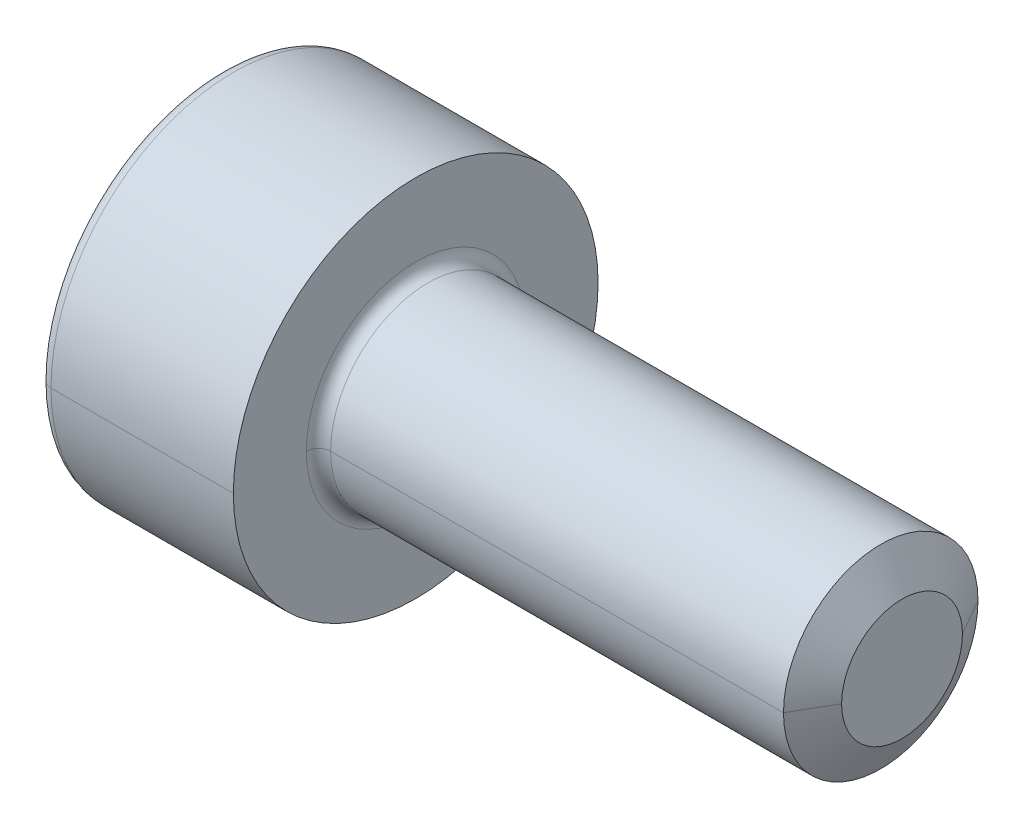
ISO-10303-21;
HEADER;
FILE_DESCRIPTION(('STEP AP214'),'2;1');
FILE_NAME('part.step','',(''),(''),'','','');
FILE_SCHEMA(('AUTOMOTIVE_DESIGN { 1 0 10303 214 1 1 1 1 }'));
ENDSEC;
DATA;
#1=APPLICATION_CONTEXT('core data for automotive mechanical design processes');
#2=APPLICATION_PROTOCOL_DEFINITION('international standard','automotive_design',2000,#1);
#3=PRODUCT_CONTEXT('',#1,'mechanical');
#4=PRODUCT('Part','Part','',(#3));
#5=PRODUCT_RELATED_PRODUCT_CATEGORY('part','',(#4));
#6=PRODUCT_DEFINITION_FORMATION('','',#4);
#7=PRODUCT_DEFINITION_CONTEXT('part definition',#1,'design');
#8=PRODUCT_DEFINITION('design','',#6,#7);
#9=PRODUCT_DEFINITION_SHAPE('','',#8);
#10=(LENGTH_UNIT() NAMED_UNIT(*) SI_UNIT(.MILLI.,.METRE.));
#11=(NAMED_UNIT(*) PLANE_ANGLE_UNIT() SI_UNIT($,.RADIAN.));
#12=(NAMED_UNIT(*) SI_UNIT($,.STERADIAN.) SOLID_ANGLE_UNIT());
#13=UNCERTAINTY_MEASURE_WITH_UNIT(LENGTH_MEASURE(1.E-05),#10,'distance_accuracy_value','');
#14=(GEOMETRIC_REPRESENTATION_CONTEXT(3) GLOBAL_UNCERTAINTY_ASSIGNED_CONTEXT((#13)) GLOBAL_UNIT_ASSIGNED_CONTEXT((#10,
#11,#12)) REPRESENTATION_CONTEXT('',''));
#15=CARTESIAN_POINT('',(0.,0.,0.));
#16=DIRECTION('',(0.,0.,1.));
#17=DIRECTION('',(1.,0.,0.));
#18=AXIS2_PLACEMENT_3D('',#15,#16,#17);
#19=CARTESIAN_POINT('',(5.6,0.8,0.));
#20=DIRECTION('',(1.,0.,0.));
#21=DIRECTION('',(0.,1.,0.));
#22=AXIS2_PLACEMENT_3D('',#19,#20,#21);
#23=PLANE('',#22);
#24=CARTESIAN_POINT('',(5.6,0.,0.));
#25=DIRECTION('',(-1.,0.,0.));
#26=DIRECTION('',(0.,0.,1.));
#27=AXIS2_PLACEMENT_3D('',#24,#25,#26);
#28=CIRCLE('',#27,0.4969);
#29=CARTESIAN_POINT('',(5.6,0.,0.4969));
#30=VERTEX_POINT('',#29);
#31=CARTESIAN_POINT('',(5.6,0.,-0.4969));
#32=VERTEX_POINT('',#31);
#33=EDGE_CURVE('E282',#30,#32,#28,.T.);
#34=ORIENTED_EDGE('',*,*,#33,.F.);
#35=CARTESIAN_POINT('',(5.6,0.,0.));
#36=DIRECTION('',(-1.,0.,0.));
#37=DIRECTION('',(0.,0.,1.));
#38=AXIS2_PLACEMENT_3D('',#35,#36,#37);
#39=CIRCLE('',#38,0.4969);
#40=EDGE_CURVE('E10',#32,#30,#39,.T.);
#41=ORIENTED_EDGE('',*,*,#40,.F.);
#42=EDGE_LOOP('',(#34,#41));
#43=FACE_BOUND('',#42,.T.);
#44=ADVANCED_FACE('F16',(#43),#23,.T.);
#45=CARTESIAN_POINT('',(5.425,0.,0.));
#46=DIRECTION('',(-1.,0.,0.));
#47=DIRECTION('',(0.,0.,1.));
#48=AXIS2_PLACEMENT_3D('',#45,#46,#47);
#49=CONICAL_SURFACE('',#48,0.8,1.04718484902492);
#50=DIRECTION('',(-0.500011000363017,0.,-0.866019052628737));
#51=VECTOR('',#50,1.);
#52=CARTESIAN_POINT('',(5.425,0.,-0.8));
#53=LINE('',#52,#51);
#54=CARTESIAN_POINT('',(5.425,0.,-0.8));
#55=VERTEX_POINT('',#54);
#56=EDGE_CURVE('E286',#32,#55,#53,.T.);
#57=ORIENTED_EDGE('',*,*,#56,.F.);
#58=ORIENTED_EDGE('',*,*,#40,.T.);
#59=DIRECTION('',(-0.500011000363017,0.,0.866019052628737));
#60=VECTOR('',#59,1.);
#61=CARTESIAN_POINT('',(5.425,0.,0.8));
#62=LINE('',#61,#60);
#63=CARTESIAN_POINT('',(5.425,0.,0.8));
#64=VERTEX_POINT('',#63);
#65=EDGE_CURVE('E300',#30,#64,#62,.T.);
#66=ORIENTED_EDGE('',*,*,#65,.T.);
#67=CARTESIAN_POINT('',(5.425,0.,0.));
#68=DIRECTION('',(-1.,0.,0.));
#69=DIRECTION('',(0.,0.,1.));
#70=AXIS2_PLACEMENT_3D('',#67,#68,#69);
#71=CIRCLE('',#70,0.8);
#72=EDGE_CURVE('E152',#55,#64,#71,.T.);
#73=ORIENTED_EDGE('',*,*,#72,.F.);
#74=EDGE_LOOP('',(#57,#58,#66,#73));
#75=FACE_BOUND('',#74,.T.);
#76=ADVANCED_FACE('F333',(#75),#49,.T.);
#77=CARTESIAN_POINT('',(0.1,0.,0.));
#78=DIRECTION('',(-1.,0.,0.));
#79=DIRECTION('',(0.,0.,1.));
#80=AXIS2_PLACEMENT_3D('',#77,#78,#79);
#81=TOROIDAL_SURFACE('',#80,1.4,0.1);
#82=CARTESIAN_POINT('',(0.1,0.,-1.4));
#83=DIRECTION('',(0.,1.,0.));
#84=DIRECTION('',(0.,0.,1.));
#85=AXIS2_PLACEMENT_3D('',#82,#83,#84);
#86=CIRCLE('',#85,0.1);
#87=CARTESIAN_POINT('',(0.1,0.,-1.5));
#88=VERTEX_POINT('',#87);
#89=CARTESIAN_POINT('',(0.,0.,-1.4));
#90=VERTEX_POINT('',#89);
#91=EDGE_CURVE('E169',#88,#90,#86,.T.);
#92=ORIENTED_EDGE('',*,*,#91,.F.);
#93=CARTESIAN_POINT('',(0.1,0.,0.));
#94=DIRECTION('',(1.,0.,0.));
#95=DIRECTION('',(0.,0.,1.));
#96=AXIS2_PLACEMENT_3D('',#93,#94,#95);
#97=CIRCLE('',#96,1.5);
#98=CARTESIAN_POINT('',(0.1,0.,1.5));
#99=VERTEX_POINT('',#98);
#100=EDGE_CURVE('E157',#99,#88,#97,.T.);
#101=ORIENTED_EDGE('',*,*,#100,.F.);
#102=CARTESIAN_POINT('',(0.1,0.,1.4));
#103=DIRECTION('',(0.,-1.,0.));
#104=DIRECTION('',(0.,0.,-1.));
#105=AXIS2_PLACEMENT_3D('',#102,#103,#104);
#106=CIRCLE('',#105,0.1);
#107=CARTESIAN_POINT('',(0.,0.,1.4));
#108=VERTEX_POINT('',#107);
#109=EDGE_CURVE('E160',#99,#108,#106,.T.);
#110=ORIENTED_EDGE('',*,*,#109,.T.);
#111=CARTESIAN_POINT('',(0.,0.,0.));
#112=DIRECTION('',(-1.,0.,0.));
#113=DIRECTION('',(0.,0.,1.));
#114=AXIS2_PLACEMENT_3D('',#111,#112,#113);
#115=CIRCLE('',#114,1.4);
#116=EDGE_CURVE('E145',#90,#108,#115,.T.);
#117=ORIENTED_EDGE('',*,*,#116,.F.);
#118=EDGE_LOOP('',(#92,#101,#110,#117));
#119=FACE_BOUND('',#118,.T.);
#120=ADVANCED_FACE('F158',(#119),#81,.T.);
#121=CARTESIAN_POINT('',(0.7,-0.4325,0.749111974273539));
#122=DIRECTION('',(-1.,0.,0.));
#123=DIRECTION('',(0.,0.,1.));
#124=AXIS2_PLACEMENT_3D('',#121,#122,#123);
#125=PLANE('',#124);
#126=DIRECTION('',(0.,0.5,0.866025403784439));
#127=VECTOR('',#126,1.);
#128=CARTESIAN_POINT('',(0.7,-0.865,0.));
#129=LINE('',#128,#127);
#130=CARTESIAN_POINT('',(0.7,-0.865,0.));
#131=VERTEX_POINT('',#130);
#132=CARTESIAN_POINT('',(0.7,-0.4325,0.749111974273539));
#133=VERTEX_POINT('',#132);
#134=EDGE_CURVE('E247',#131,#133,#129,.T.);
#135=ORIENTED_EDGE('',*,*,#134,.T.);
#136=DIRECTION('',(0.,1.,0.));
#137=VECTOR('',#136,1.);
#138=CARTESIAN_POINT('',(0.7,-0.4325,0.749111974273539));
#139=LINE('',#138,#137);
#140=CARTESIAN_POINT('',(0.7,0.4325,0.749111974273539));
#141=VERTEX_POINT('',#140);
#142=EDGE_CURVE('E25',#133,#141,#139,.T.);
#143=ORIENTED_EDGE('',*,*,#142,.T.);
#144=DIRECTION('',(0.,0.5,-0.866025403784439));
#145=VECTOR('',#144,1.);
#146=CARTESIAN_POINT('',(0.7,0.4325,0.749111974273539));
#147=LINE('',#146,#145);
#148=CARTESIAN_POINT('',(0.7,0.865,0.));
#149=VERTEX_POINT('',#148);
#150=EDGE_CURVE('E46',#141,#149,#147,.T.);
#151=ORIENTED_EDGE('',*,*,#150,.T.);
#152=DIRECTION('',(0.,-0.5,-0.866025403784439));
#153=VECTOR('',#152,1.);
#154=CARTESIAN_POINT('',(0.7,0.865,0.));
#155=LINE('',#154,#153);
#156=CARTESIAN_POINT('',(0.7,0.4325,-0.74911197427354));
#157=VERTEX_POINT('',#156);
#158=EDGE_CURVE('E265',#149,#157,#155,.T.);
#159=ORIENTED_EDGE('',*,*,#158,.T.);
#160=DIRECTION('',(0.,-1.,0.));
#161=VECTOR('',#160,1.);
#162=CARTESIAN_POINT('',(0.7,0.4325,-0.74911197427354));
#163=LINE('',#162,#161);
#164=CARTESIAN_POINT('',(0.7,-0.4325,-0.74911197427354));
#165=VERTEX_POINT('',#164);
#166=EDGE_CURVE('E219',#157,#165,#163,.T.);
#167=ORIENTED_EDGE('',*,*,#166,.T.);
#168=DIRECTION('',(0.,-0.5,0.866025403784439));
#169=VECTOR('',#168,1.);
#170=CARTESIAN_POINT('',(0.7,-0.4325,-0.74911197427354));
#171=LINE('',#170,#169);
#172=EDGE_CURVE('E254',#165,#131,#171,.T.);
#173=ORIENTED_EDGE('',*,*,#172,.T.);
#174=EDGE_LOOP('',(#135,#143,#151,#159,#167,#173));
#175=FACE_BOUND('',#174,.T.);
#176=ADVANCED_FACE('F369',(#175),#125,.T.);
#177=CARTESIAN_POINT('',(0.7,-0.4325,0.749111974273539));
#178=DIRECTION('',(0.,0.,1.));
#179=DIRECTION('',(1.,0.,0.));
#180=AXIS2_PLACEMENT_3D('',#177,#178,#179);
#181=PLANE('',#180);
#182=DIRECTION('',(0.,1.,0.));
#183=VECTOR('',#182,1.);
#184=CARTESIAN_POINT('',(0.,-0.4325,0.749111974273539));
#185=LINE('',#184,#183);
#186=CARTESIAN_POINT('',(0.,-0.4325,0.749111974273539));
#187=VERTEX_POINT('',#186);
#188=CARTESIAN_POINT('',(0.,0.4325,0.749111974273539));
#189=VERTEX_POINT('',#188);
#190=EDGE_CURVE('E240',#187,#189,#185,.T.);
#191=ORIENTED_EDGE('',*,*,#190,.T.);
#192=DIRECTION('',(-1.,0.,0.));
#193=VECTOR('',#192,1.);
#194=CARTESIAN_POINT('',(0.7,0.4325,0.749111974273539));
#195=LINE('',#194,#193);
#196=EDGE_CURVE('E19',#141,#189,#195,.T.);
#197=ORIENTED_EDGE('',*,*,#196,.F.);
#198=ORIENTED_EDGE('',*,*,#142,.F.);
#199=DIRECTION('',(-1.,0.,0.));
#200=VECTOR('',#199,1.);
#201=CARTESIAN_POINT('',(0.7,-0.4325,0.749111974273539));
#202=LINE('',#201,#200);
#203=EDGE_CURVE('E239',#133,#187,#202,.T.);
#204=ORIENTED_EDGE('',*,*,#203,.T.);
#205=EDGE_LOOP('',(#191,#197,#198,#204));
#206=FACE_BOUND('',#205,.T.);
#207=ADVANCED_FACE('F368',(#206),#181,.F.);
#208=CARTESIAN_POINT('',(0.7,0.4325,0.749111974273539));
#209=DIRECTION('',(0.,0.866025403784439,0.5));
#210=DIRECTION('',(1.,0.,0.));
#211=AXIS2_PLACEMENT_3D('',#208,#209,#210);
#212=PLANE('',#211);
#213=DIRECTION('',(0.,0.5,-0.866025403784439));
#214=VECTOR('',#213,1.);
#215=CARTESIAN_POINT('',(0.,0.4325,0.749111974273539));
#216=LINE('',#215,#214);
#217=CARTESIAN_POINT('',(0.,0.865,0.));
#218=VERTEX_POINT('',#217);
#219=EDGE_CURVE('E235',#189,#218,#216,.T.);
#220=ORIENTED_EDGE('',*,*,#219,.T.);
#221=DIRECTION('',(-1.,0.,0.));
#222=VECTOR('',#221,1.);
#223=CARTESIAN_POINT('',(0.7,0.865,0.));
#224=LINE('',#223,#222);
#225=EDGE_CURVE('E264',#149,#218,#224,.T.);
#226=ORIENTED_EDGE('',*,*,#225,.F.);
#227=ORIENTED_EDGE('',*,*,#150,.F.);
#228=ORIENTED_EDGE('',*,*,#196,.T.);
#229=EDGE_LOOP('',(#220,#226,#227,#228));
#230=FACE_BOUND('',#229,.T.);
#231=ADVANCED_FACE('F366',(#230),#212,.F.);
#232=CARTESIAN_POINT('',(0.7,0.865,0.));
#233=DIRECTION('',(0.,0.866025403784439,-0.5));
#234=DIRECTION('',(-1.,0.,0.));
#235=AXIS2_PLACEMENT_3D('',#232,#233,#234);
#236=PLANE('',#235);
#237=DIRECTION('',(0.,-0.5,-0.866025403784439));
#238=VECTOR('',#237,1.);
#239=CARTESIAN_POINT('',(0.,0.865,0.));
#240=LINE('',#239,#238);
#241=CARTESIAN_POINT('',(0.,0.4325,-0.74911197427354));
#242=VERTEX_POINT('',#241);
#243=EDGE_CURVE('E229',#218,#242,#240,.T.);
#244=ORIENTED_EDGE('',*,*,#243,.T.);
#245=DIRECTION('',(-1.,0.,0.));
#246=VECTOR('',#245,1.);
#247=CARTESIAN_POINT('',(0.7,0.4325,-0.74911197427354));
#248=LINE('',#247,#246);
#249=EDGE_CURVE('E224',#157,#242,#248,.T.);
#250=ORIENTED_EDGE('',*,*,#249,.F.);
#251=ORIENTED_EDGE('',*,*,#158,.F.);
#252=ORIENTED_EDGE('',*,*,#225,.T.);
#253=EDGE_LOOP('',(#244,#250,#251,#252));
#254=FACE_BOUND('',#253,.T.);
#255=ADVANCED_FACE('F379',(#254),#236,.F.);
#256=CARTESIAN_POINT('',(0.7,0.4325,-0.74911197427354));
#257=DIRECTION('',(0.,0.,-1.));
#258=DIRECTION('',(0.,-1.,0.));
#259=AXIS2_PLACEMENT_3D('',#256,#257,#258);
#260=PLANE('',#259);
#261=DIRECTION('',(0.,-1.,0.));
#262=VECTOR('',#261,1.);
#263=CARTESIAN_POINT('',(0.,0.4325,-0.74911197427354));
#264=LINE('',#263,#262);
#265=CARTESIAN_POINT('',(0.,-0.4325,-0.74911197427354));
#266=VERTEX_POINT('',#265);
#267=EDGE_CURVE('E218',#242,#266,#264,.T.);
#268=ORIENTED_EDGE('',*,*,#267,.T.);
#269=DIRECTION('',(-1.,0.,0.));
#270=VECTOR('',#269,1.);
#271=CARTESIAN_POINT('',(0.7,-0.4325,-0.74911197427354));
#272=LINE('',#271,#270);
#273=EDGE_CURVE('E221',#165,#266,#272,.T.);
#274=ORIENTED_EDGE('',*,*,#273,.F.);
#275=ORIENTED_EDGE('',*,*,#166,.F.);
#276=ORIENTED_EDGE('',*,*,#249,.T.);
#277=EDGE_LOOP('',(#268,#274,#275,#276));
#278=FACE_BOUND('',#277,.T.);
#279=ADVANCED_FACE('F383',(#278),#260,.F.);
#280=CARTESIAN_POINT('',(0.7,-0.4325,-0.74911197427354));
#281=DIRECTION('',(0.,-0.866025403784439,-0.5));
#282=DIRECTION('',(0.,0.5,-0.866025403784439));
#283=AXIS2_PLACEMENT_3D('',#280,#281,#282);
#284=PLANE('',#283);
#285=DIRECTION('',(0.,-0.5,0.866025403784439));
#286=VECTOR('',#285,1.);
#287=CARTESIAN_POINT('',(0.,-0.4325,-0.74911197427354));
#288=LINE('',#287,#286);
#289=CARTESIAN_POINT('',(0.,-0.865,0.));
#290=VERTEX_POINT('',#289);
#291=EDGE_CURVE('E214',#266,#290,#288,.T.);
#292=ORIENTED_EDGE('',*,*,#291,.T.);
#293=DIRECTION('',(-1.,0.,0.));
#294=VECTOR('',#293,1.);
#295=CARTESIAN_POINT('',(0.7,-0.865,0.));
#296=LINE('',#295,#294);
#297=EDGE_CURVE('E252',#131,#290,#296,.T.);
#298=ORIENTED_EDGE('',*,*,#297,.F.);
#299=ORIENTED_EDGE('',*,*,#172,.F.);
#300=ORIENTED_EDGE('',*,*,#273,.T.);
#301=EDGE_LOOP('',(#292,#298,#299,#300));
#302=FACE_BOUND('',#301,.T.);
#303=ADVANCED_FACE('F405',(#302),#284,.F.);
#304=CARTESIAN_POINT('',(0.7,-0.865,0.));
#305=DIRECTION('',(0.,-0.866025403784439,0.5));
#306=DIRECTION('',(-1.,0.,0.));
#307=AXIS2_PLACEMENT_3D('',#304,#305,#306);
#308=PLANE('',#307);
#309=DIRECTION('',(0.,0.5,0.866025403784439));
#310=VECTOR('',#309,1.);
#311=CARTESIAN_POINT('',(0.,-0.865,0.));
#312=LINE('',#311,#310);
#313=EDGE_CURVE('E153',#290,#187,#312,.T.);
#314=ORIENTED_EDGE('',*,*,#313,.T.);
#315=ORIENTED_EDGE('',*,*,#203,.F.);
#316=ORIENTED_EDGE('',*,*,#134,.F.);
#317=ORIENTED_EDGE('',*,*,#297,.T.);
#318=EDGE_LOOP('',(#314,#315,#316,#317));
#319=FACE_BOUND('',#318,.T.);
#320=ADVANCED_FACE('F329',(#319),#308,.F.);
#321=CARTESIAN_POINT('',(1.7,0.,0.));
#322=DIRECTION('',(1.,0.,0.));
#323=DIRECTION('',(0.,0.,-1.));
#324=AXIS2_PLACEMENT_3D('',#321,#322,#323);
#325=TOROIDAL_SURFACE('',#324,0.9,0.1);
#326=CARTESIAN_POINT('',(1.7,0.,0.9));
#327=DIRECTION('',(0.,1.,0.));
#328=DIRECTION('',(0.,0.,1.));
#329=AXIS2_PLACEMENT_3D('',#326,#327,#328);
#330=CIRCLE('',#329,0.1);
#331=CARTESIAN_POINT('',(1.7,0.,0.8));
#332=VERTEX_POINT('',#331);
#333=CARTESIAN_POINT('',(1.6,0.,0.9));
#334=VERTEX_POINT('',#333);
#335=EDGE_CURVE('E179',#332,#334,#330,.T.);
#336=ORIENTED_EDGE('',*,*,#335,.F.);
#337=CARTESIAN_POINT('',(1.7,0.,0.));
#338=DIRECTION('',(1.,0.,0.));
#339=DIRECTION('',(0.,0.,-1.));
#340=AXIS2_PLACEMENT_3D('',#337,#338,#339);
#341=CIRCLE('',#340,0.8);
#342=CARTESIAN_POINT('',(1.7,0.,-0.8));
#343=VERTEX_POINT('',#342);
#344=EDGE_CURVE('E196',#343,#332,#341,.T.);
#345=ORIENTED_EDGE('',*,*,#344,.F.);
#346=CARTESIAN_POINT('',(1.7,0.,-0.9));
#347=DIRECTION('',(0.,-1.,0.));
#348=DIRECTION('',(0.,0.,-1.));
#349=AXIS2_PLACEMENT_3D('',#346,#347,#348);
#350=CIRCLE('',#349,0.1);
#351=CARTESIAN_POINT('',(1.6,0.,-0.9));
#352=VERTEX_POINT('',#351);
#353=EDGE_CURVE('E192',#343,#352,#350,.T.);
#354=ORIENTED_EDGE('',*,*,#353,.T.);
#355=CARTESIAN_POINT('',(1.6,0.,0.));
#356=DIRECTION('',(1.,0.,0.));
#357=DIRECTION('',(0.,0.,-1.));
#358=AXIS2_PLACEMENT_3D('',#355,#356,#357);
#359=CIRCLE('',#358,0.9);
#360=EDGE_CURVE('E236',#352,#334,#359,.T.);
#361=ORIENTED_EDGE('',*,*,#360,.T.);
#362=EDGE_LOOP('',(#336,#345,#354,#361));
#363=FACE_BOUND('',#362,.T.);
#364=ADVANCED_FACE('F321',(#363),#325,.F.);
#365=CARTESIAN_POINT('',(1.6,1.5,0.));
#366=DIRECTION('',(1.,0.,0.));
#367=DIRECTION('',(0.,1.,0.));
#368=AXIS2_PLACEMENT_3D('',#365,#366,#367);
#369=PLANE('',#368);
#370=ORIENTED_EDGE('',*,*,#360,.F.);
#371=CARTESIAN_POINT('',(1.6,0.,0.));
#372=DIRECTION('',(1.,0.,0.));
#373=DIRECTION('',(0.,0.,-1.));
#374=AXIS2_PLACEMENT_3D('',#371,#372,#373);
#375=CIRCLE('',#374,0.9);
#376=EDGE_CURVE('E183',#334,#352,#375,.T.);
#377=ORIENTED_EDGE('',*,*,#376,.F.);
#378=EDGE_LOOP('',(#370,#377));
#379=FACE_BOUND('',#378,.T.);
#380=CARTESIAN_POINT('',(1.6,0.,0.));
#381=DIRECTION('',(1.,0.,0.));
#382=DIRECTION('',(0.,0.,-1.));
#383=AXIS2_PLACEMENT_3D('',#380,#381,#382);
#384=CIRCLE('',#383,1.5);
#385=CARTESIAN_POINT('',(1.6,0.,-1.5));
#386=VERTEX_POINT('',#385);
#387=CARTESIAN_POINT('',(1.6,0.,1.5));
#388=VERTEX_POINT('',#387);
#389=EDGE_CURVE('E184',#386,#388,#384,.T.);
#390=ORIENTED_EDGE('',*,*,#389,.T.);
#391=CARTESIAN_POINT('',(1.6,0.,0.));
#392=DIRECTION('',(1.,0.,0.));
#393=DIRECTION('',(0.,0.,-1.));
#394=AXIS2_PLACEMENT_3D('',#391,#392,#393);
#395=CIRCLE('',#394,1.5);
#396=EDGE_CURVE('E241',#388,#386,#395,.T.);
#397=ORIENTED_EDGE('',*,*,#396,.T.);
#398=EDGE_LOOP('',(#390,#397));
#399=FACE_BOUND('',#398,.T.);
#400=ADVANCED_FACE('F317',(#379,#399),#369,.T.);
#401=CARTESIAN_POINT('',(0.,0.,0.));
#402=DIRECTION('',(1.,0.,0.));
#403=DIRECTION('',(0.,0.,-1.));
#404=AXIS2_PLACEMENT_3D('',#401,#402,#403);
#405=CYLINDRICAL_SURFACE('',#404,1.5);
#406=DIRECTION('',(1.,0.,0.));
#407=VECTOR('',#406,1.);
#408=CARTESIAN_POINT('',(0.,0.,1.5));
#409=LINE('',#408,#407);
#410=EDGE_CURVE('E189',#99,#388,#409,.T.);
#411=ORIENTED_EDGE('',*,*,#410,.F.);
#412=ORIENTED_EDGE('',*,*,#100,.T.);
#413=DIRECTION('',(1.,0.,0.));
#414=VECTOR('',#413,1.);
#415=CARTESIAN_POINT('',(0.,0.,-1.5));
#416=LINE('',#415,#414);
#417=EDGE_CURVE('E188',#88,#386,#416,.T.);
#418=ORIENTED_EDGE('',*,*,#417,.T.);
#419=ORIENTED_EDGE('',*,*,#396,.F.);
#420=EDGE_LOOP('',(#411,#412,#418,#419));
#421=FACE_BOUND('',#420,.T.);
#422=ADVANCED_FACE('F320',(#421),#405,.T.);
#423=CARTESIAN_POINT('',(0.,0.,0.));
#424=DIRECTION('',(-1.,0.,0.));
#425=DIRECTION('',(0.,0.,1.));
#426=AXIS2_PLACEMENT_3D('',#423,#424,#425);
#427=PLANE('',#426);
#428=ORIENTED_EDGE('',*,*,#313,.F.);
#429=ORIENTED_EDGE('',*,*,#291,.F.);
#430=ORIENTED_EDGE('',*,*,#267,.F.);
#431=ORIENTED_EDGE('',*,*,#243,.F.);
#432=ORIENTED_EDGE('',*,*,#219,.F.);
#433=ORIENTED_EDGE('',*,*,#190,.F.);
#434=EDGE_LOOP('',(#428,#429,#430,#431,#432,#433));
#435=FACE_BOUND('',#434,.T.);
#436=CARTESIAN_POINT('',(0.,0.,0.));
#437=DIRECTION('',(-1.,0.,0.));
#438=DIRECTION('',(0.,0.,1.));
#439=AXIS2_PLACEMENT_3D('',#436,#437,#438);
#440=CIRCLE('',#439,1.4);
#441=EDGE_CURVE('E146',#108,#90,#440,.T.);
#442=ORIENTED_EDGE('',*,*,#441,.T.);
#443=ORIENTED_EDGE('',*,*,#116,.T.);
#444=EDGE_LOOP('',(#442,#443));
#445=FACE_BOUND('',#444,.T.);
#446=ADVANCED_FACE('F148',(#435,#445),#427,.T.);
#447=CARTESIAN_POINT('',(0.,0.,0.));
#448=DIRECTION('',(1.,0.,0.));
#449=DIRECTION('',(0.,0.,-1.));
#450=AXIS2_PLACEMENT_3D('',#447,#448,#449);
#451=CYLINDRICAL_SURFACE('',#450,0.8);
#452=DIRECTION('',(1.,0.,0.));
#453=VECTOR('',#452,1.);
#454=CARTESIAN_POINT('',(0.,0.,0.8));
#455=LINE('',#454,#453);
#456=EDGE_CURVE('E205',#332,#64,#455,.T.);
#457=ORIENTED_EDGE('',*,*,#456,.F.);
#458=CARTESIAN_POINT('',(1.7,0.,0.));
#459=DIRECTION('',(1.,0.,0.));
#460=DIRECTION('',(0.,0.,-1.));
#461=AXIS2_PLACEMENT_3D('',#458,#459,#460);
#462=CIRCLE('',#461,0.8);
#463=EDGE_CURVE('E164',#332,#343,#462,.T.);
#464=ORIENTED_EDGE('',*,*,#463,.T.);
#465=DIRECTION('',(1.,0.,0.));
#466=VECTOR('',#465,1.);
#467=CARTESIAN_POINT('',(0.,0.,-0.8));
#468=LINE('',#467,#466);
#469=EDGE_CURVE('E206',#343,#55,#468,.T.);
#470=ORIENTED_EDGE('',*,*,#469,.T.);
#471=ORIENTED_EDGE('',*,*,#72,.T.);
#472=EDGE_LOOP('',(#457,#464,#470,#471));
#473=FACE_BOUND('',#472,.T.);
#474=ADVANCED_FACE('F347',(#473),#451,.T.);
#475=CARTESIAN_POINT('',(0.,0.,0.));
#476=DIRECTION('',(1.,0.,0.));
#477=DIRECTION('',(0.,0.,-1.));
#478=AXIS2_PLACEMENT_3D('',#475,#476,#477);
#479=CYLINDRICAL_SURFACE('',#478,0.8);
#480=ORIENTED_EDGE('',*,*,#344,.T.);
#481=ORIENTED_EDGE('',*,*,#456,.T.);
#482=CARTESIAN_POINT('',(5.425,0.,0.));
#483=DIRECTION('',(-1.,0.,0.));
#484=DIRECTION('',(0.,0.,1.));
#485=AXIS2_PLACEMENT_3D('',#482,#483,#484);
#486=CIRCLE('',#485,0.8);
#487=EDGE_CURVE('E293',#64,#55,#486,.T.);
#488=ORIENTED_EDGE('',*,*,#487,.T.);
#489=ORIENTED_EDGE('',*,*,#469,.F.);
#490=EDGE_LOOP('',(#480,#481,#488,#489));
#491=FACE_BOUND('',#490,.T.);
#492=ADVANCED_FACE('F344',(#491),#479,.T.);
#493=CARTESIAN_POINT('',(0.,0.,0.));
#494=DIRECTION('',(1.,0.,0.));
#495=DIRECTION('',(0.,0.,-1.));
#496=AXIS2_PLACEMENT_3D('',#493,#494,#495);
#497=CYLINDRICAL_SURFACE('',#496,1.5);
#498=CARTESIAN_POINT('',(0.1,0.,0.));
#499=DIRECTION('',(1.,0.,0.));
#500=DIRECTION('',(0.,0.,1.));
#501=AXIS2_PLACEMENT_3D('',#498,#499,#500);
#502=CIRCLE('',#501,1.5);
#503=EDGE_CURVE('E175',#88,#99,#502,.T.);
#504=ORIENTED_EDGE('',*,*,#503,.T.);
#505=ORIENTED_EDGE('',*,*,#410,.T.);
#506=ORIENTED_EDGE('',*,*,#389,.F.);
#507=ORIENTED_EDGE('',*,*,#417,.F.);
#508=EDGE_LOOP('',(#504,#505,#506,#507));
#509=FACE_BOUND('',#508,.T.);
#510=ADVANCED_FACE('F314',(#509),#497,.T.);
#511=CARTESIAN_POINT('',(1.7,0.,0.));
#512=DIRECTION('',(1.,0.,0.));
#513=DIRECTION('',(0.,0.,-1.));
#514=AXIS2_PLACEMENT_3D('',#511,#512,#513);
#515=TOROIDAL_SURFACE('',#514,0.9,0.1);
#516=ORIENTED_EDGE('',*,*,#463,.F.);
#517=ORIENTED_EDGE('',*,*,#335,.T.);
#518=ORIENTED_EDGE('',*,*,#376,.T.);
#519=ORIENTED_EDGE('',*,*,#353,.F.);
#520=EDGE_LOOP('',(#516,#517,#518,#519));
#521=FACE_BOUND('',#520,.T.);
#522=ADVANCED_FACE('F352',(#521),#515,.F.);
#523=CARTESIAN_POINT('',(0.1,0.,0.));
#524=DIRECTION('',(-1.,0.,0.));
#525=DIRECTION('',(0.,0.,1.));
#526=AXIS2_PLACEMENT_3D('',#523,#524,#525);
#527=TOROIDAL_SURFACE('',#526,1.4,0.1);
#528=ORIENTED_EDGE('',*,*,#503,.F.);
#529=ORIENTED_EDGE('',*,*,#91,.T.);
#530=ORIENTED_EDGE('',*,*,#441,.F.);
#531=ORIENTED_EDGE('',*,*,#109,.F.);
#532=EDGE_LOOP('',(#528,#529,#530,#531));
#533=FACE_BOUND('',#532,.T.);
#534=ADVANCED_FACE('F170',(#533),#527,.T.);
#535=CARTESIAN_POINT('',(5.425,0.,0.));
#536=DIRECTION('',(-1.,0.,0.));
#537=DIRECTION('',(0.,0.,1.));
#538=AXIS2_PLACEMENT_3D('',#535,#536,#537);
#539=CONICAL_SURFACE('',#538,0.8,1.04718484902492);
#540=ORIENTED_EDGE('',*,*,#33,.T.);
#541=ORIENTED_EDGE('',*,*,#56,.T.);
#542=ORIENTED_EDGE('',*,*,#487,.F.);
#543=ORIENTED_EDGE('',*,*,#65,.F.);
#544=EDGE_LOOP('',(#540,#541,#542,#543));
#545=FACE_BOUND('',#544,.T.);
#546=ADVANCED_FACE('F343',(#545),#539,.T.);
#547=CLOSED_SHELL('',(#44,#76,#120,#176,#207,#231,#255,#279,#303,#320,#364,#400,#422,#446,#474,
#492,#510,#522,#534,#546));
#548=MANIFOLD_SOLID_BREP('B1',#547);
#549=ADVANCED_BREP_SHAPE_REPRESENTATION('',(#18,#548),#14);
#550=SHAPE_DEFINITION_REPRESENTATION(#9,#549);
ENDSEC;
END-ISO-10303-21;
